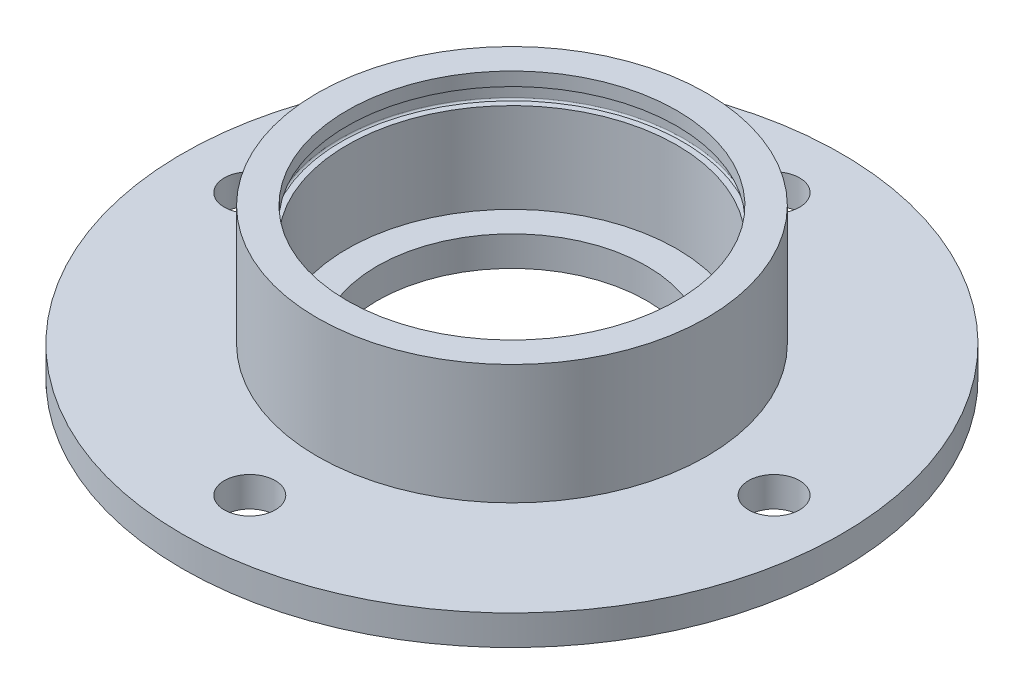
ISO-10303-21;
HEADER;
FILE_DESCRIPTION(('STEP AP214'),'2;1');
FILE_NAME('part.step','',(''),(''),'','','');
FILE_SCHEMA(('AUTOMOTIVE_DESIGN { 1 0 10303 214 1 1 1 1 }'));
ENDSEC;
DATA;
#1=APPLICATION_CONTEXT('core data for automotive mechanical design processes');
#2=APPLICATION_PROTOCOL_DEFINITION('international standard','automotive_design',2000,#1);
#3=PRODUCT_CONTEXT('',#1,'mechanical');
#4=PRODUCT('Part','Part','',(#3));
#5=PRODUCT_RELATED_PRODUCT_CATEGORY('part','',(#4));
#6=PRODUCT_DEFINITION_FORMATION('','',#4);
#7=PRODUCT_DEFINITION_CONTEXT('part definition',#1,'design');
#8=PRODUCT_DEFINITION('design','',#6,#7);
#9=PRODUCT_DEFINITION_SHAPE('','',#8);
#10=(LENGTH_UNIT() NAMED_UNIT(*) SI_UNIT(.MILLI.,.METRE.));
#11=(NAMED_UNIT(*) PLANE_ANGLE_UNIT() SI_UNIT($,.RADIAN.));
#12=(NAMED_UNIT(*) SI_UNIT($,.STERADIAN.) SOLID_ANGLE_UNIT());
#13=UNCERTAINTY_MEASURE_WITH_UNIT(LENGTH_MEASURE(1.E-05),#10,'distance_accuracy_value','');
#14=(GEOMETRIC_REPRESENTATION_CONTEXT(3) GLOBAL_UNCERTAINTY_ASSIGNED_CONTEXT((#13)) GLOBAL_UNIT_ASSIGNED_CONTEXT((#10,
#11,#12)) REPRESENTATION_CONTEXT('',''));
#15=CARTESIAN_POINT('',(0.,0.,0.));
#16=DIRECTION('',(0.,0.,1.));
#17=DIRECTION('',(1.,0.,0.));
#18=AXIS2_PLACEMENT_3D('',#15,#16,#17);
#19=CARTESIAN_POINT('',(0.,17.9540192467724,0.));
#20=DIRECTION('',(0.,1.,0.));
#21=DIRECTION('',(0.,0.,1.));
#22=AXIS2_PLACEMENT_3D('',#19,#20,#21);
#23=CYLINDRICAL_SURFACE('',#22,11.);
#24=CARTESIAN_POINT('',(0.,0.,0.));
#25=DIRECTION('',(0.,1.,0.));
#26=DIRECTION('',(0.,0.,1.));
#27=AXIS2_PLACEMENT_3D('',#24,#25,#26);
#28=CIRCLE('',#27,11.);
#29=CARTESIAN_POINT('',(0.,0.,11.));
#30=VERTEX_POINT('',#29);
#31=EDGE_CURVE('E43',#30,#30,#28,.T.);
#32=ORIENTED_EDGE('',*,*,#31,.F.);
#33=EDGE_LOOP('',(#32));
#34=FACE_BOUND('',#33,.T.);
#35=CARTESIAN_POINT('',(0.,6.,0.));
#36=DIRECTION('',(0.,1.,0.));
#37=DIRECTION('',(0.,0.,1.));
#38=AXIS2_PLACEMENT_3D('',#35,#36,#37);
#39=CIRCLE('',#38,11.);
#40=CARTESIAN_POINT('',(0.,6.,11.));
#41=VERTEX_POINT('',#40);
#42=EDGE_CURVE('E39',#41,#41,#39,.F.);
#43=ORIENTED_EDGE('',*,*,#42,.F.);
#44=EDGE_LOOP('',(#43));
#45=FACE_BOUND('',#44,.T.);
#46=ADVANCED_FACE('F35',(#34,#45),#23,.F.);
#47=CARTESIAN_POINT('',(0.,8.,0.));
#48=DIRECTION('',(0.,1.,0.));
#49=DIRECTION('',(0.,0.,1.));
#50=AXIS2_PLACEMENT_3D('',#47,#48,#49);
#51=CIRCLE('',#50,11.);
#52=CARTESIAN_POINT('',(0.,8.,11.));
#53=VERTEX_POINT('',#52);
#54=EDGE_CURVE('E48',#53,#53,#51,.T.);
#55=ORIENTED_EDGE('',*,*,#54,.T.);
#56=EDGE_LOOP('',(#55));
#57=FACE_BOUND('',#56,.T.);
#58=CARTESIAN_POINT('',(0.,7.1,0.));
#59=DIRECTION('',(0.,-1.,0.));
#60=DIRECTION('',(0.,0.,-1.));
#61=AXIS2_PLACEMENT_3D('',#58,#59,#60);
#62=CIRCLE('',#61,11.);
#63=CARTESIAN_POINT('',(0.,7.1,-11.));
#64=VERTEX_POINT('',#63);
#65=EDGE_CURVE('E51',#64,#64,#62,.F.);
#66=ORIENTED_EDGE('',*,*,#65,.F.);
#67=EDGE_LOOP('',(#66));
#68=FACE_BOUND('',#67,.T.);
#69=ADVANCED_FACE('F84',(#57,#68),#23,.F.);
#70=CARTESIAN_POINT('',(0.,17.9540192467724,0.));
#71=DIRECTION('',(0.,1.,0.));
#72=DIRECTION('',(0.,0.,1.));
#73=AXIS2_PLACEMENT_3D('',#70,#71,#72);
#74=CYLINDRICAL_SURFACE('',#73,9.);
#75=CARTESIAN_POINT('',(0.,-2.,0.));
#76=DIRECTION('',(0.,1.,0.));
#77=DIRECTION('',(0.,0.,1.));
#78=AXIS2_PLACEMENT_3D('',#75,#76,#77);
#79=CIRCLE('',#78,9.);
#80=CARTESIAN_POINT('',(0.,-2.,9.));
#81=VERTEX_POINT('',#80);
#82=EDGE_CURVE('E57',#81,#81,#79,.T.);
#83=ORIENTED_EDGE('',*,*,#82,.F.);
#84=EDGE_LOOP('',(#83));
#85=FACE_BOUND('',#84,.T.);
#86=CARTESIAN_POINT('',(0.,0.,0.));
#87=DIRECTION('',(0.,1.,0.));
#88=DIRECTION('',(0.,0.,1.));
#89=AXIS2_PLACEMENT_3D('',#86,#87,#88);
#90=CIRCLE('',#89,9.);
#91=CARTESIAN_POINT('',(0.,0.,9.));
#92=VERTEX_POINT('',#91);
#93=EDGE_CURVE('E10',#92,#92,#90,.T.);
#94=ORIENTED_EDGE('',*,*,#93,.T.);
#95=EDGE_LOOP('',(#94));
#96=FACE_BOUND('',#95,.T.);
#97=ADVANCED_FACE('F37',(#85,#96),#74,.F.);
#98=CARTESIAN_POINT('',(9.,0.,0.));
#99=DIRECTION('',(0.,-1.,0.));
#100=DIRECTION('',(0.,0.,-1.));
#101=AXIS2_PLACEMENT_3D('',#98,#99,#100);
#102=PLANE('',#101);
#103=ORIENTED_EDGE('',*,*,#93,.F.);
#104=EDGE_LOOP('',(#103));
#105=FACE_BOUND('',#104,.T.);
#106=ORIENTED_EDGE('',*,*,#31,.T.);
#107=EDGE_LOOP('',(#106));
#108=FACE_BOUND('',#107,.T.);
#109=ADVANCED_FACE('F91',(#105,#108),#102,.F.);
#110=CARTESIAN_POINT('',(11.,8.,0.));
#111=DIRECTION('',(0.,-1.,0.));
#112=DIRECTION('',(0.,0.,-1.));
#113=AXIS2_PLACEMENT_3D('',#110,#111,#112);
#114=PLANE('',#113);
#115=ORIENTED_EDGE('',*,*,#54,.F.);
#116=EDGE_LOOP('',(#115));
#117=FACE_BOUND('',#116,.T.);
#118=CARTESIAN_POINT('',(0.,8.,0.));
#119=DIRECTION('',(0.,1.,0.));
#120=DIRECTION('',(0.,0.,1.));
#121=AXIS2_PLACEMENT_3D('',#118,#119,#120);
#122=CIRCLE('',#121,13.);
#123=CARTESIAN_POINT('',(0.,8.,13.));
#124=VERTEX_POINT('',#123);
#125=EDGE_CURVE('E79',#124,#124,#122,.T.);
#126=ORIENTED_EDGE('',*,*,#125,.T.);
#127=EDGE_LOOP('',(#126));
#128=FACE_BOUND('',#127,.T.);
#129=ADVANCED_FACE('F87',(#117,#128),#114,.F.);
#130=CARTESIAN_POINT('',(0.,17.9540192467724,0.));
#131=DIRECTION('',(0.,1.,0.));
#132=DIRECTION('',(0.,0.,1.));
#133=AXIS2_PLACEMENT_3D('',#130,#131,#132);
#134=CYLINDRICAL_SURFACE('',#133,13.);
#135=ORIENTED_EDGE('',*,*,#125,.F.);
#136=EDGE_LOOP('',(#135));
#137=FACE_BOUND('',#136,.T.);
#138=CARTESIAN_POINT('',(0.,0.,0.));
#139=DIRECTION('',(0.,1.,0.));
#140=DIRECTION('',(0.,0.,1.));
#141=AXIS2_PLACEMENT_3D('',#138,#139,#140);
#142=CIRCLE('',#141,13.);
#143=CARTESIAN_POINT('',(0.,0.,13.));
#144=VERTEX_POINT('',#143);
#145=EDGE_CURVE('E76',#144,#144,#142,.T.);
#146=ORIENTED_EDGE('',*,*,#145,.T.);
#147=EDGE_LOOP('',(#146));
#148=FACE_BOUND('',#147,.T.);
#149=ADVANCED_FACE('F90',(#137,#148),#134,.T.);
#150=CARTESIAN_POINT('',(13.,0.,0.));
#151=DIRECTION('',(0.,-1.,0.));
#152=DIRECTION('',(0.,0.,-1.));
#153=AXIS2_PLACEMENT_3D('',#150,#151,#152);
#154=PLANE('',#153);
#155=CARTESIAN_POINT('',(0.,0.,-17.5));
#156=DIRECTION('',(0.,1.,0.));
#157=DIRECTION('',(0.,0.,1.));
#158=AXIS2_PLACEMENT_3D('',#155,#156,#157);
#159=CIRCLE('',#158,1.7);
#160=CARTESIAN_POINT('',(0.,0.,-15.8));
#161=VERTEX_POINT('',#160);
#162=EDGE_CURVE('E176',#161,#161,#159,.T.);
#163=ORIENTED_EDGE('',*,*,#162,.F.);
#164=EDGE_LOOP('',(#163));
#165=FACE_BOUND('',#164,.T.);
#166=CARTESIAN_POINT('',(17.5,0.,0.));
#167=DIRECTION('',(0.,1.,0.));
#168=DIRECTION('',(0.,0.,1.));
#169=AXIS2_PLACEMENT_3D('',#166,#167,#168);
#170=CIRCLE('',#169,1.7);
#171=CARTESIAN_POINT('',(17.5,0.,1.7));
#172=VERTEX_POINT('',#171);
#173=EDGE_CURVE('E178',#172,#172,#170,.T.);
#174=ORIENTED_EDGE('',*,*,#173,.F.);
#175=EDGE_LOOP('',(#174));
#176=FACE_BOUND('',#175,.T.);
#177=CARTESIAN_POINT('',(0.,0.,17.5));
#178=DIRECTION('',(0.,1.,0.));
#179=DIRECTION('',(0.,0.,1.));
#180=AXIS2_PLACEMENT_3D('',#177,#178,#179);
#181=CIRCLE('',#180,1.7);
#182=CARTESIAN_POINT('',(0.,0.,19.2));
#183=VERTEX_POINT('',#182);
#184=EDGE_CURVE('E186',#183,#183,#181,.T.);
#185=ORIENTED_EDGE('',*,*,#184,.F.);
#186=EDGE_LOOP('',(#185));
#187=FACE_BOUND('',#186,.T.);
#188=CARTESIAN_POINT('',(-17.5,0.,0.));
#189=DIRECTION('',(0.,1.,0.));
#190=DIRECTION('',(0.,0.,1.));
#191=AXIS2_PLACEMENT_3D('',#188,#189,#190);
#192=CIRCLE('',#191,1.7);
#193=CARTESIAN_POINT('',(-17.5,0.,1.7));
#194=VERTEX_POINT('',#193);
#195=EDGE_CURVE('E192',#194,#194,#192,.T.);
#196=ORIENTED_EDGE('',*,*,#195,.F.);
#197=EDGE_LOOP('',(#196));
#198=FACE_BOUND('',#197,.T.);
#199=ORIENTED_EDGE('',*,*,#145,.F.);
#200=EDGE_LOOP('',(#199));
#201=FACE_BOUND('',#200,.T.);
#202=CARTESIAN_POINT('',(0.,0.,0.));
#203=DIRECTION('',(0.,1.,0.));
#204=DIRECTION('',(0.,0.,1.));
#205=AXIS2_PLACEMENT_3D('',#202,#203,#204);
#206=CIRCLE('',#205,22.);
#207=CARTESIAN_POINT('',(0.,0.,22.));
#208=VERTEX_POINT('',#207);
#209=EDGE_CURVE('E73',#208,#208,#206,.T.);
#210=ORIENTED_EDGE('',*,*,#209,.T.);
#211=EDGE_LOOP('',(#210));
#212=FACE_BOUND('',#211,.T.);
#213=ADVANCED_FACE('F97',(#165,#176,#187,#198,#201,#212),#154,.F.);
#214=CARTESIAN_POINT('',(0.,17.9540192467724,0.));
#215=DIRECTION('',(0.,1.,0.));
#216=DIRECTION('',(0.,0.,1.));
#217=AXIS2_PLACEMENT_3D('',#214,#215,#216);
#218=CYLINDRICAL_SURFACE('',#217,22.);
#219=ORIENTED_EDGE('',*,*,#209,.F.);
#220=EDGE_LOOP('',(#219));
#221=FACE_BOUND('',#220,.T.);
#222=CARTESIAN_POINT('',(0.,-2.,0.));
#223=DIRECTION('',(0.,1.,0.));
#224=DIRECTION('',(0.,0.,1.));
#225=AXIS2_PLACEMENT_3D('',#222,#223,#224);
#226=CIRCLE('',#225,22.);
#227=CARTESIAN_POINT('',(0.,-2.,22.));
#228=VERTEX_POINT('',#227);
#229=EDGE_CURVE('E70',#228,#228,#226,.T.);
#230=ORIENTED_EDGE('',*,*,#229,.T.);
#231=EDGE_LOOP('',(#230));
#232=FACE_BOUND('',#231,.T.);
#233=ADVANCED_FACE('F103',(#221,#232),#218,.T.);
#234=CARTESIAN_POINT('',(22.,-2.,0.));
#235=DIRECTION('',(0.,1.,0.));
#236=DIRECTION('',(0.,0.,1.));
#237=AXIS2_PLACEMENT_3D('',#234,#235,#236);
#238=PLANE('',#237);
#239=CARTESIAN_POINT('',(0.,-2.,-17.5));
#240=DIRECTION('',(0.,1.,0.));
#241=DIRECTION('',(0.,0.,1.));
#242=AXIS2_PLACEMENT_3D('',#239,#240,#241);
#243=CIRCLE('',#242,1.7);
#244=CARTESIAN_POINT('',(0.,-2.,-15.8));
#245=VERTEX_POINT('',#244);
#246=EDGE_CURVE('E173',#245,#245,#243,.T.);
#247=ORIENTED_EDGE('',*,*,#246,.T.);
#248=EDGE_LOOP('',(#247));
#249=FACE_BOUND('',#248,.T.);
#250=CARTESIAN_POINT('',(17.5,-2.,0.));
#251=DIRECTION('',(0.,1.,0.));
#252=DIRECTION('',(0.,0.,1.));
#253=AXIS2_PLACEMENT_3D('',#250,#251,#252);
#254=CIRCLE('',#253,1.7);
#255=CARTESIAN_POINT('',(17.5,-2.,1.7));
#256=VERTEX_POINT('',#255);
#257=EDGE_CURVE('E183',#256,#256,#254,.T.);
#258=ORIENTED_EDGE('',*,*,#257,.T.);
#259=EDGE_LOOP('',(#258));
#260=FACE_BOUND('',#259,.T.);
#261=CARTESIAN_POINT('',(0.,-2.,17.5));
#262=DIRECTION('',(0.,1.,0.));
#263=DIRECTION('',(0.,0.,1.));
#264=AXIS2_PLACEMENT_3D('',#261,#262,#263);
#265=CIRCLE('',#264,1.7);
#266=CARTESIAN_POINT('',(0.,-2.,19.2));
#267=VERTEX_POINT('',#266);
#268=EDGE_CURVE('E189',#267,#267,#265,.T.);
#269=ORIENTED_EDGE('',*,*,#268,.T.);
#270=EDGE_LOOP('',(#269));
#271=FACE_BOUND('',#270,.T.);
#272=CARTESIAN_POINT('',(-17.5,-2.,0.));
#273=DIRECTION('',(0.,1.,0.));
#274=DIRECTION('',(0.,0.,1.));
#275=AXIS2_PLACEMENT_3D('',#272,#273,#274);
#276=CIRCLE('',#275,1.7);
#277=CARTESIAN_POINT('',(-17.5,-2.,1.7));
#278=VERTEX_POINT('',#277);
#279=EDGE_CURVE('E195',#278,#278,#276,.T.);
#280=ORIENTED_EDGE('',*,*,#279,.T.);
#281=EDGE_LOOP('',(#280));
#282=FACE_BOUND('',#281,.T.);
#283=ORIENTED_EDGE('',*,*,#229,.F.);
#284=EDGE_LOOP('',(#283));
#285=FACE_BOUND('',#284,.T.);
#286=ORIENTED_EDGE('',*,*,#82,.T.);
#287=EDGE_LOOP('',(#286));
#288=FACE_BOUND('',#287,.T.);
#289=ADVANCED_FACE('F110',(#249,#260,#271,#282,#285,#288),#238,.F.);
#290=CARTESIAN_POINT('',(0.,6.,11.39));
#291=DIRECTION('',(0.,1.,0.));
#292=DIRECTION('',(0.,0.,1.));
#293=AXIS2_PLACEMENT_3D('',#290,#291,#292);
#294=PLANE('',#293);
#295=CARTESIAN_POINT('',(0.,6.,0.));
#296=DIRECTION('',(0.,1.,0.));
#297=DIRECTION('',(0.,0.,1.));
#298=AXIS2_PLACEMENT_3D('',#295,#296,#297);
#299=CIRCLE('',#298,11.39);
#300=CARTESIAN_POINT('',(0.,6.,11.39));
#301=VERTEX_POINT('',#300);
#302=EDGE_CURVE('E53',#301,#301,#299,.T.);
#303=ORIENTED_EDGE('',*,*,#302,.T.);
#304=EDGE_LOOP('',(#303));
#305=FACE_BOUND('',#304,.T.);
#306=ORIENTED_EDGE('',*,*,#42,.T.);
#307=EDGE_LOOP('',(#306));
#308=FACE_BOUND('',#307,.T.);
#309=ADVANCED_FACE('F116',(#305,#308),#294,.T.);
#310=CARTESIAN_POINT('',(0.,7.1,9.9));
#311=DIRECTION('',(0.,-1.,0.));
#312=DIRECTION('',(0.,0.,-1.));
#313=AXIS2_PLACEMENT_3D('',#310,#311,#312);
#314=PLANE('',#313);
#315=CARTESIAN_POINT('',(0.,7.1,0.));
#316=DIRECTION('',(0.,1.,0.));
#317=DIRECTION('',(0.,0.,1.));
#318=AXIS2_PLACEMENT_3D('',#315,#316,#317);
#319=CIRCLE('',#318,11.39);
#320=CARTESIAN_POINT('',(0.,7.1,11.39));
#321=VERTEX_POINT('',#320);
#322=EDGE_CURVE('E198',#321,#321,#319,.T.);
#323=ORIENTED_EDGE('',*,*,#322,.F.);
#324=EDGE_LOOP('',(#323));
#325=FACE_BOUND('',#324,.T.);
#326=ORIENTED_EDGE('',*,*,#65,.T.);
#327=EDGE_LOOP('',(#326));
#328=FACE_BOUND('',#327,.T.);
#329=ADVANCED_FACE('F137',(#325,#328),#314,.T.);
#330=CARTESIAN_POINT('',(0.,6.11,0.));
#331=DIRECTION('',(0.,1.,0.));
#332=DIRECTION('',(0.,0.,1.));
#333=AXIS2_PLACEMENT_3D('',#330,#331,#332);
#334=TOROIDAL_SURFACE('',#333,11.39,0.110000000000001);
#335=CARTESIAN_POINT('',(0.,6.11,0.));
#336=DIRECTION('',(0.,1.,0.));
#337=DIRECTION('',(0.,0.,1.));
#338=AXIS2_PLACEMENT_3D('',#335,#336,#337);
#339=CIRCLE('',#338,11.5);
#340=CARTESIAN_POINT('',(0.,6.11,11.5));
#341=VERTEX_POINT('',#340);
#342=EDGE_CURVE('E59',#341,#341,#339,.T.);
#343=ORIENTED_EDGE('',*,*,#342,.T.);
#344=EDGE_LOOP('',(#343));
#345=FACE_BOUND('',#344,.T.);
#346=ORIENTED_EDGE('',*,*,#302,.F.);
#347=EDGE_LOOP('',(#346));
#348=FACE_BOUND('',#347,.T.);
#349=ADVANCED_FACE('F138',(#345,#348),#334,.F.);
#350=CARTESIAN_POINT('',(0.,-32.0459807532276,0.));
#351=DIRECTION('',(0.,1.,0.));
#352=DIRECTION('',(0.,0.,1.));
#353=AXIS2_PLACEMENT_3D('',#350,#351,#352);
#354=CYLINDRICAL_SURFACE('',#353,11.5);
#355=CARTESIAN_POINT('',(0.,6.99,0.));
#356=DIRECTION('',(0.,1.,0.));
#357=DIRECTION('',(0.,0.,1.));
#358=AXIS2_PLACEMENT_3D('',#355,#356,#357);
#359=CIRCLE('',#358,11.5);
#360=CARTESIAN_POINT('',(0.,6.99,11.5));
#361=VERTEX_POINT('',#360);
#362=EDGE_CURVE('E64',#361,#361,#359,.T.);
#363=ORIENTED_EDGE('',*,*,#362,.T.);
#364=EDGE_LOOP('',(#363));
#365=FACE_BOUND('',#364,.T.);
#366=ORIENTED_EDGE('',*,*,#342,.F.);
#367=EDGE_LOOP('',(#366));
#368=FACE_BOUND('',#367,.T.);
#369=ADVANCED_FACE('F141',(#365,#368),#354,.F.);
#370=CARTESIAN_POINT('',(0.,6.99,0.));
#371=DIRECTION('',(0.,1.,0.));
#372=DIRECTION('',(0.,0.,1.));
#373=AXIS2_PLACEMENT_3D('',#370,#371,#372);
#374=TOROIDAL_SURFACE('',#373,11.39,0.109999999999998);
#375=ORIENTED_EDGE('',*,*,#322,.T.);
#376=EDGE_LOOP('',(#375));
#377=FACE_BOUND('',#376,.T.);
#378=ORIENTED_EDGE('',*,*,#362,.F.);
#379=EDGE_LOOP('',(#378));
#380=FACE_BOUND('',#379,.T.);
#381=ADVANCED_FACE('F145',(#377,#380),#374,.F.);
#382=CARTESIAN_POINT('',(-17.5,0.,0.));
#383=DIRECTION('',(0.,1.,0.));
#384=DIRECTION('',(0.,0.,1.));
#385=AXIS2_PLACEMENT_3D('',#382,#383,#384);
#386=CYLINDRICAL_SURFACE('',#385,1.7);
#387=ORIENTED_EDGE('',*,*,#279,.F.);
#388=EDGE_LOOP('',(#387));
#389=FACE_BOUND('',#388,.T.);
#390=ORIENTED_EDGE('',*,*,#195,.T.);
#391=EDGE_LOOP('',(#390));
#392=FACE_BOUND('',#391,.T.);
#393=ADVANCED_FACE('F149',(#389,#392),#386,.F.);
#394=CARTESIAN_POINT('',(0.,0.,17.5));
#395=DIRECTION('',(0.,1.,0.));
#396=DIRECTION('',(0.,0.,1.));
#397=AXIS2_PLACEMENT_3D('',#394,#395,#396);
#398=CYLINDRICAL_SURFACE('',#397,1.7);
#399=ORIENTED_EDGE('',*,*,#268,.F.);
#400=EDGE_LOOP('',(#399));
#401=FACE_BOUND('',#400,.T.);
#402=ORIENTED_EDGE('',*,*,#184,.T.);
#403=EDGE_LOOP('',(#402));
#404=FACE_BOUND('',#403,.T.);
#405=ADVANCED_FACE('F156',(#401,#404),#398,.F.);
#406=CARTESIAN_POINT('',(17.5,0.,0.));
#407=DIRECTION('',(0.,1.,0.));
#408=DIRECTION('',(0.,0.,1.));
#409=AXIS2_PLACEMENT_3D('',#406,#407,#408);
#410=CYLINDRICAL_SURFACE('',#409,1.7);
#411=ORIENTED_EDGE('',*,*,#257,.F.);
#412=EDGE_LOOP('',(#411));
#413=FACE_BOUND('',#412,.T.);
#414=ORIENTED_EDGE('',*,*,#173,.T.);
#415=EDGE_LOOP('',(#414));
#416=FACE_BOUND('',#415,.T.);
#417=ADVANCED_FACE('F160',(#413,#416),#410,.F.);
#418=CARTESIAN_POINT('',(0.,0.,-17.5));
#419=DIRECTION('',(0.,1.,0.));
#420=DIRECTION('',(0.,0.,1.));
#421=AXIS2_PLACEMENT_3D('',#418,#419,#420);
#422=CYLINDRICAL_SURFACE('',#421,1.7);
#423=ORIENTED_EDGE('',*,*,#246,.F.);
#424=EDGE_LOOP('',(#423));
#425=FACE_BOUND('',#424,.T.);
#426=ORIENTED_EDGE('',*,*,#162,.T.);
#427=EDGE_LOOP('',(#426));
#428=FACE_BOUND('',#427,.T.);
#429=ADVANCED_FACE('F164',(#425,#428),#422,.F.);
#430=CLOSED_SHELL('',(#46,#69,#97,#109,#129,#149,#213,#233,#289,#309,#329,#349,#369,#381,#393,
#405,#417,#429));
#431=MANIFOLD_SOLID_BREP('B2',#430);
#432=ADVANCED_BREP_SHAPE_REPRESENTATION('',(#18,#431),#14);
#433=SHAPE_DEFINITION_REPRESENTATION(#9,#432);
ENDSEC;
END-ISO-10303-21;
